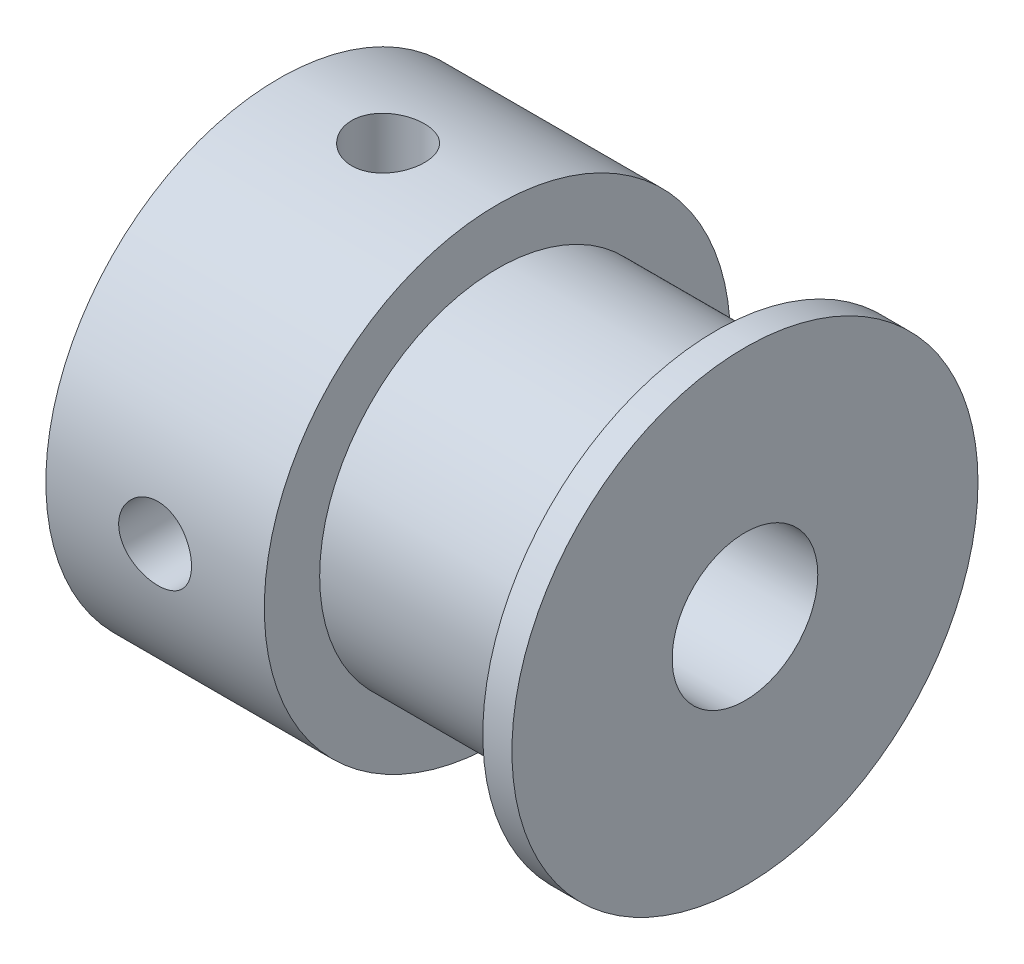
ISO-10303-21;
HEADER;
FILE_DESCRIPTION(('STEP AP214'),'2;1');
FILE_NAME('part.step','',(''),(''),'','','');
FILE_SCHEMA(('AUTOMOTIVE_DESIGN { 1 0 10303 214 1 1 1 1 }'));
ENDSEC;
DATA;
#1=APPLICATION_CONTEXT('core data for automotive mechanical design processes');
#2=APPLICATION_PROTOCOL_DEFINITION('international standard','automotive_design',2000,#1);
#3=PRODUCT_CONTEXT('',#1,'mechanical');
#4=PRODUCT('Part','Part','',(#3));
#5=PRODUCT_RELATED_PRODUCT_CATEGORY('part','',(#4));
#6=PRODUCT_DEFINITION_FORMATION('','',#4);
#7=PRODUCT_DEFINITION_CONTEXT('part definition',#1,'design');
#8=PRODUCT_DEFINITION('design','',#6,#7);
#9=PRODUCT_DEFINITION_SHAPE('','',#8);
#10=(LENGTH_UNIT() NAMED_UNIT(*) SI_UNIT(.MILLI.,.METRE.));
#11=(NAMED_UNIT(*) PLANE_ANGLE_UNIT() SI_UNIT($,.RADIAN.));
#12=(NAMED_UNIT(*) SI_UNIT($,.STERADIAN.) SOLID_ANGLE_UNIT());
#13=UNCERTAINTY_MEASURE_WITH_UNIT(LENGTH_MEASURE(1.E-05),#10,'distance_accuracy_value','');
#14=(GEOMETRIC_REPRESENTATION_CONTEXT(3) GLOBAL_UNCERTAINTY_ASSIGNED_CONTEXT((#13)) GLOBAL_UNIT_ASSIGNED_CONTEXT((#10,
#11,#12)) REPRESENTATION_CONTEXT('',''));
#15=CARTESIAN_POINT('',(0.,0.,0.));
#16=DIRECTION('',(0.,0.,1.));
#17=DIRECTION('',(1.,0.,0.));
#18=AXIS2_PLACEMENT_3D('',#15,#16,#17);
#19=CARTESIAN_POINT('',(0.,0.,0.));
#20=DIRECTION('',(1.,0.,0.));
#21=DIRECTION('',(0.,0.,-1.));
#22=AXIS2_PLACEMENT_3D('',#19,#20,#21);
#23=CYLINDRICAL_SURFACE('',#22,2.5);
#24=CARTESIAN_POINT('',(2.50000000000001,0.,2.5));
#25=CARTESIAN_POINT('',(2.50000412789938,0.0657149536912328,2.49999641755189));
#26=CARTESIAN_POINT('',(2.5052125914021,0.13150824962254,2.49738113774397));
#27=CARTESIAN_POINT('',(2.52581610042615,0.26115029408553,2.48717695046745));
#28=CARTESIAN_POINT('',(2.54123049124707,0.324995108391878,2.4795785978623));
#29=CARTESIAN_POINT('',(2.581492260771,0.448666931100716,2.4602034925414));
#30=CARTESIAN_POINT('',(2.60630298031002,0.508508503673972,2.448442989719));
#31=CARTESIAN_POINT('',(2.66446327670618,0.623090771008203,2.42182220644723));
#32=CARTESIAN_POINT('',(2.69781218031107,0.677831867487559,2.40696217041913));
#33=CARTESIAN_POINT('',(2.77439656185663,0.784384772202395,2.37445322822571));
#34=CARTESIAN_POINT('',(2.81810809904956,0.835819013902635,2.3566899890942));
#35=CARTESIAN_POINT('',(2.9131518490588,0.930974306083717,2.32074962808431));
#36=CARTESIAN_POINT('',(2.96448981471556,0.974689478883453,2.30257220261294));
#37=CARTESIAN_POINT('',(3.07810418690423,1.05656500056284,2.26623688996684));
#38=CARTESIAN_POINT('',(3.14092012293239,1.09403166943954,2.24818983712665));
#39=CARTESIAN_POINT('',(3.27295916998277,1.15771028361336,2.21607473465401));
#40=CARTESIAN_POINT('',(3.34217766090344,1.18393026870791,2.20200384508738));
#41=CARTESIAN_POINT('',(3.4808313817774,1.22266555273573,2.18072333797261));
#42=CARTESIAN_POINT('',(3.55000556508424,1.23590732135054,2.17315339479642));
#43=CARTESIAN_POINT('',(3.68997354722435,1.25053374163605,2.1647736243566));
#44=CARTESIAN_POINT('',(3.76076567608894,1.25193011046634,2.16395711679111));
#45=CARTESIAN_POINT('',(3.89285753039421,1.24335910896536,2.16888662821561));
#46=CARTESIAN_POINT('',(3.95428003902881,1.23473069942102,2.17385954577517));
#47=CARTESIAN_POINT('',(4.0746523867163,1.20867481132116,2.18845285917313));
#48=CARTESIAN_POINT('',(4.13360143163164,1.19124452987206,2.19807473539721));
#49=CARTESIAN_POINT('',(4.24903641570707,1.1477622254825,2.22109345515927));
#50=CARTESIAN_POINT('',(4.30543299848223,1.12151883389499,2.23457300829999));
#51=CARTESIAN_POINT('',(4.41329286573751,1.061302109585,2.26379255351755));
#52=CARTESIAN_POINT('',(4.46475391950011,1.02732530476558,2.27953355975239));
#53=CARTESIAN_POINT('',(4.56815156592903,0.94758256864098,2.31391447379108));
#54=CARTESIAN_POINT('',(4.61932109197019,0.900868072961596,2.33266887795933));
#55=CARTESIAN_POINT('',(4.71341927323862,0.799444473426711,2.36934529125509));
#56=CARTESIAN_POINT('',(4.75634399004235,0.744731570717852,2.38726689948501));
#57=CARTESIAN_POINT('',(4.83460707628715,0.625645632289806,2.42127484103705));
#58=CARTESIAN_POINT('',(4.86950059055717,0.560941989499257,2.43723730202509));
#59=CARTESIAN_POINT('',(4.92762128630376,0.425582769360993,2.46447351401553));
#60=CARTESIAN_POINT('',(4.95085773126895,0.354931970331593,2.47575098679441));
#61=CARTESIAN_POINT('',(4.98309425464584,0.215958114575875,2.49155417176795));
#62=CARTESIAN_POINT('',(4.99311404468347,0.147926913185404,2.4965617287664));
#63=CARTESIAN_POINT('',(5.00183091391811,0.010974499936691,2.50091266823877));
#64=CARTESIAN_POINT('',(5.00053335704934,-0.0579462748373773,2.5002587340164));
#65=CARTESIAN_POINT('',(4.98724163947655,-0.189041214982492,2.49363990316801));
#66=CARTESIAN_POINT('',(4.97608433408745,-0.251324260062442,2.48809057110237));
#67=CARTESIAN_POINT('',(4.94470241013114,-0.373008615377395,2.47277714143524));
#68=CARTESIAN_POINT('',(4.92447679193329,-0.432409607113745,2.46301257917916));
#69=CARTESIAN_POINT('',(4.87500191695853,-0.54861076056208,2.43980314267087));
#70=CARTESIAN_POINT('',(4.84551118735398,-0.60528799625769,2.42626102212424));
#71=CARTESIAN_POINT('',(4.77861558044244,-0.713076702123648,2.39679967896386));
#72=CARTESIAN_POINT('',(4.7412073317582,-0.7641857872191,2.38087944457232));
#73=CARTESIAN_POINT('',(4.6552994683339,-0.864709611613313,2.34635276671831));
#74=CARTESIAN_POINT('',(4.60607141443304,-0.913465097280795,2.32763606060552));
#75=CARTESIAN_POINT('',(4.50009356091336,-1.00232040139155,2.29077989504843));
#76=CARTESIAN_POINT('',(4.44333860147953,-1.04241423211355,2.27264084226908));
#77=CARTESIAN_POINT('',(4.32044543224961,-1.11463489312211,2.23813990282585));
#78=CARTESIAN_POINT('',(4.25398591723925,-1.14628186984829,2.2219066207934));
#79=CARTESIAN_POINT('',(4.11561241538434,-1.19760353251725,2.19467590460158));
#80=CARTESIAN_POINT('',(4.04370559187351,-1.21729364485946,2.18367172800773));
#81=CARTESIAN_POINT('',(3.90386222142319,-1.24232710931209,2.16951876260834));
#82=CARTESIAN_POINT('',(3.8362071832137,-1.24886624550107,2.16571729325615));
#83=CARTESIAN_POINT('',(3.70069116603659,-1.25086144297598,2.16456693307719));
#84=CARTESIAN_POINT('',(3.63283028907571,-1.24632230828049,2.16721524534441));
#85=CARTESIAN_POINT('',(3.50564562308498,-1.22740765699032,2.17797327562531));
#86=CARTESIAN_POINT('',(3.4461244123195,-1.21401039292849,2.18553868102992));
#87=CARTESIAN_POINT('',(3.33023985071912,-1.1789691977808,2.20463770234897));
#88=CARTESIAN_POINT('',(3.27387752238504,-1.15732261394976,2.21617259462095));
#89=CARTESIAN_POINT('',(3.16171893626674,-1.10476968162585,2.24285662955661));
#90=CARTESIAN_POINT('',(3.10621512271288,-1.07333892227057,2.25819652995239));
#91=CARTESIAN_POINT('',(3.00090682977427,-1.00268871454579,2.29044164543238));
#92=CARTESIAN_POINT('',(2.95110533685189,-0.963465214048303,2.30734767243153));
#93=CARTESIAN_POINT('',(2.85232252205298,-0.872754158330795,2.34327903949142));
#94=CARTESIAN_POINT('',(2.8041761220476,-0.820355528762707,2.36231229139336));
#95=CARTESIAN_POINT('',(2.71717127072046,-0.707693507775343,2.3984719031886));
#96=CARTESIAN_POINT('',(2.67831782571714,-0.647425904070975,2.4155972326005));
#97=CARTESIAN_POINT('',(2.61095454654725,-0.519914496024928,2.44622511981379));
#98=CARTESIAN_POINT('',(2.58251978823571,-0.452624379918262,2.45970120703636));
#99=CARTESIAN_POINT('',(2.53773979010132,-0.313427626617734,2.48126676704332));
#100=CARTESIAN_POINT('',(2.52136019146303,-0.241534749528953,2.48937154216165));
#101=CARTESIAN_POINT('',(2.50762823615519,-0.140752433104226,2.49619327387079));
#102=CARTESIAN_POINT('',(2.50477169892048,-0.112702349299371,2.49761706674002));
#103=CARTESIAN_POINT('',(2.500956668104,-0.0564396647589457,2.49952121222331));
#104=CARTESIAN_POINT('',(2.49999822691101,-0.0282270595592261,2.50000153879704));
#105=CARTESIAN_POINT('',(2.50000000000001,0.,2.5));
#106=B_SPLINE_CURVE_WITH_KNOTS('',3,(#24,#25,#26,#27,#28,#29,#30,#31,#32,#33,#34,#35,#36,#37,
#38,#39,#40,#41,#42,#43,#44,#45,#46,#47,#48,#49,#50,#51,#52,#53,#54,#55,#56,#57,#58,#59,#60,#61,
#62,#63,#64,#65,#66,#67,#68,#69,#70,#71,#72,#73,#74,#75,#76,#77,#78,#79,#80,#81,#82,#83,#84,#85,
#86,#87,#88,#89,#90,#91,#92,#93,#94,#95,#96,#97,#98,#99,#100,#101,#102,#103,#104,#105),
.UNSPECIFIED.,.T.,.F.,(4,2,2,2,2,2,2,2,2,2,2,2,2,2,2,2,2,2,2,2,2,2,2,2,2,2,2,2,2,2,2,2,2,2,2,2,
2,2,2,2,4),(0.,0.197030321775365,0.394435187136495,0.59107769436537,0.787704700726955,
0.996227198397606,1.20490779706754,1.4297715803844,1.6544743487285,1.86572515175286,
2.07676696661274,2.26257140511649,2.44843504907097,2.63862800210608,2.82890651575276,
3.04331176667346,3.25781918248356,3.48228777768049,3.70657771140347,3.9122911308918,
4.11790705639343,4.3075863313265,4.49728652038662,4.69241070034871,4.88761813435421,
5.10199513305521,5.31651985769287,5.54143352699589,5.76605639925969,5.96911634372964,
6.17208824825003,6.35572412805225,6.53941910979594,6.73545570969514,6.93159451423693,
7.15156553440619,7.37165479220712,7.59330017078652,7.81431135781158,7.89894100172117,
7.98357298143554),.UNSPECIFIED.);
#107=CARTESIAN_POINT('',(2.50000000000001,0.,2.5));
#108=VERTEX_POINT('',#107);
#109=EDGE_CURVE('E90',#108,#108,#106,.T.);
#110=ORIENTED_EDGE('',*,*,#109,.F.);
#111=EDGE_LOOP('',(#110));
#112=FACE_BOUND('',#111,.T.);
#113=CARTESIAN_POINT('',(3.75,2.1650635094611,-1.25));
#114=CARTESIAN_POINT('',(3.81513476024406,2.16506918410574,-1.24999545384316));
#115=CARTESIAN_POINT('',(3.88035176440631,2.16804751484696,-1.24487496341652));
#116=CARTESIAN_POINT('',(4.00878408084644,2.17952958065066,-1.22465401237257));
#117=CARTESIAN_POINT('',(4.07199489380426,2.18804492569449,-1.20953258069272));
#118=CARTESIAN_POINT('',(4.19431458042993,2.20936683256748,-1.17012493587476));
#119=CARTESIAN_POINT('',(4.25344331559198,2.22215054341565,-1.14588744061716));
#120=CARTESIAN_POINT('',(4.3667802524959,2.25053331021072,-1.08908440672046));
#121=CARTESIAN_POINT('',(4.42098818782807,2.26613251845081,-1.05651841754472));
#122=CARTESIAN_POINT('',(4.52788216069688,2.29996086321802,-0.980833175663598));
#123=CARTESIAN_POINT('',(4.58007391959193,2.31830079547442,-0.937065045179713));
#124=CARTESIAN_POINT('',(4.67676048550839,2.35464978482132,-0.841567259518085));
#125=CARTESIAN_POINT('',(4.7212514532294,2.37265867289062,-0.789833657227866));
#126=CARTESIAN_POINT('',(4.80420893893458,2.40776846191186,-0.675611954268182));
#127=CARTESIAN_POINT('',(4.84206720982441,2.42472633022716,-0.612633986265718));
#128=CARTESIAN_POINT('',(4.9064260665572,2.45438445124411,-0.48019628324938));
#129=CARTESIAN_POINT('',(4.93293382017146,2.46708738979677,-0.410740672672694));
#130=CARTESIAN_POINT('',(4.97188082662637,2.48600576555297,-0.272556179907472));
#131=CARTESIAN_POINT('',(4.98518690794442,2.49261850276115,-0.204127238111022));
#132=CARTESIAN_POINT('',(5.0002076483438,2.50009479807584,-0.0657132858723109));
#133=CARTESIAN_POINT('',(5.00192932099464,2.50096183480737,0.00427075730467233));
#134=CARTESIAN_POINT('',(4.99406665753706,2.49703727395563,0.137290655529687));
#135=CARTESIAN_POINT('',(4.98545248059847,2.49273119865201,0.200401498970988));
#136=CARTESIAN_POINT('',(4.95889894511918,2.47967806574684,0.324142214897901));
#137=CARTESIAN_POINT('',(4.94095888877972,2.47093067582992,0.384771901367406));
#138=CARTESIAN_POINT('',(4.89614679238773,2.44964479109568,0.502886739461941));
#139=CARTESIAN_POINT('',(4.86915460853491,2.43705551911499,0.560316779393971));
#140=CARTESIAN_POINT('',(4.80717072974813,2.40922057483359,0.669971001891659));
#141=CARTESIAN_POINT('',(4.77217617087206,2.39397395196855,0.722193311048306));
#142=CARTESIAN_POINT('',(4.69138081058373,2.36055492999037,0.825217076122742));
#143=CARTESIAN_POINT('',(4.64487121459249,2.34224219997719,0.875417593786699));
#144=CARTESIAN_POINT('',(4.54426284383728,2.30567925733515,0.967630462872224));
#145=CARTESIAN_POINT('',(4.49015828465742,2.28742910332036,1.00963651446779));
#146=CARTESIAN_POINT('',(4.37168975946989,2.25180195115606,1.08688166830276));
#147=CARTESIAN_POINT('',(4.30689247118224,2.23455399988385,1.12152164372256));
#148=CARTESIAN_POINT('',(4.17132791080125,2.2046931284822,1.17914889125154));
#149=CARTESIAN_POINT('',(4.10056695872805,2.19207537557584,1.20214832276361));
#150=CARTESIAN_POINT('',(3.96098186089651,2.17430794771293,1.2339752637813));
#151=CARTESIAN_POINT('',(3.89244860119556,2.16864569810621,1.24378140264997));
#152=CARTESIAN_POINT('',(3.75449832310432,2.16397399202012,1.25189618326428));
#153=CARTESIAN_POINT('',(3.68508196360027,2.1649598361164,1.25021294664378));
#154=CARTESIAN_POINT('',(3.55543260177659,2.17292920675731,1.23629505417996));
#155=CARTESIAN_POINT('',(3.49502568611509,2.17924484383318,1.22523477089058));
#156=CARTESIAN_POINT('',(3.3770402671613,2.19617526939176,1.19462035579055));
#157=CARTESIAN_POINT('',(3.31946268656674,2.20679145006292,1.17506347327952));
#158=CARTESIAN_POINT('',(3.20573583637163,2.23170277599571,1.12705948575611));
#159=CARTESIAN_POINT('',(3.14977622893306,2.24614554053829,1.0982425796159));
#160=CARTESIAN_POINT('',(3.04316341057626,2.27695149371562,1.03285883001976));
#161=CARTESIAN_POINT('',(2.9925129456084,2.29331566693935,0.99628800541527));
#162=CARTESIAN_POINT('',(2.89127654059557,2.3285999807042,0.911046458998567));
#163=CARTESIAN_POINT('',(2.84150356160293,2.34758228942861,0.861431590393708));
#164=CARTESIAN_POINT('',(2.75073470250801,2.38417793722366,0.754255619247861));
#165=CARTESIAN_POINT('',(2.70974178721183,2.40179081259637,0.696691843319184));
#166=CARTESIAN_POINT('',(2.63678284256237,2.43426702113696,0.573169203198447));
#167=CARTESIAN_POINT('',(2.60508360223636,2.44904552090037,0.507028871967642));
#168=CARTESIAN_POINT('',(2.55357762017826,2.47354193699126,0.369402955801353));
#169=CARTESIAN_POINT('',(2.53376043579212,2.48326429595466,0.29792212674022));
#170=CARTESIAN_POINT('',(2.50828929478167,2.49584385227353,0.158724602913022));
#171=CARTESIAN_POINT('',(2.50150265515486,2.49924909885239,0.0912643048130718));
#172=CARTESIAN_POINT('',(2.498945918182,2.50052662968914,-0.0439074824390039));
#173=CARTESIAN_POINT('',(2.50317196434555,2.49840085083612,-0.111618875368858));
#174=CARTESIAN_POINT('',(2.52177050849453,2.48917461047403,-0.240672490396433));
#175=CARTESIAN_POINT('',(2.53545606157209,2.48241118334988,-0.302140397264079));
#176=CARTESIAN_POINT('',(2.57165874912871,2.46490117079279,-0.421807440229521));
#177=CARTESIAN_POINT('',(2.59417715011682,2.45415401415995,-0.480006106194385));
#178=CARTESIAN_POINT('',(2.64840881520747,2.4290741343515,-0.594279257806105));
#179=CARTESIAN_POINT('',(2.6804741540098,2.41460771498499,-0.650156428375057));
#180=CARTESIAN_POINT('',(2.75244741357381,2.38360166427283,-0.75596830226753));
#181=CARTESIAN_POINT('',(2.79235893639459,2.36706108197951,-0.805900259268633));
#182=CARTESIAN_POINT('',(2.88349642377838,2.33160762783285,-0.903642505196113));
#183=CARTESIAN_POINT('',(2.93545310934649,2.31262248764623,-0.950747105674089));
#184=CARTESIAN_POINT('',(3.04681340141221,2.27578845203566,-1.03582910924334));
#185=CARTESIAN_POINT('',(3.10622352608461,2.25794057202332,-1.07379843751257));
#186=CARTESIAN_POINT('',(3.23329580822619,2.22499506631145,-1.14053884973207));
#187=CARTESIAN_POINT('',(3.30115941391092,2.21000217820338,-1.16898133245117));
#188=CARTESIAN_POINT('',(3.44166550542472,2.1858269541044,-1.21359838688301));
#189=CARTESIAN_POINT('',(3.51429111114086,2.17662520184628,-1.22981398896918));
#190=CARTESIAN_POINT('',(3.614756694565,2.16911590752238,-1.24295875983052));
#191=CARTESIAN_POINT('',(3.64170986799735,2.1676016125644,-1.24559513120481));
#192=CARTESIAN_POINT('',(3.6957706008528,2.16557419859688,-1.24911675636245));
#193=CARTESIAN_POINT('',(3.72287817048234,2.16506114656387,-1.25000189299984));
#194=CARTESIAN_POINT('',(3.75,2.1650635094611,-1.25));
#195=B_SPLINE_CURVE_WITH_KNOTS('',3,(#113,#114,#115,#116,#117,#118,#119,#120,#121,#122,#123,
#124,#125,#126,#127,#128,#129,#130,#131,#132,#133,#134,#135,#136,#137,#138,#139,#140,#141,#142,
#143,#144,#145,#146,#147,#148,#149,#150,#151,#152,#153,#154,#155,#156,#157,#158,#159,#160,#161,
#162,#163,#164,#165,#166,#167,#168,#169,#170,#171,#172,#173,#174,#175,#176,#177,#178,#179,#180,
#181,#182,#183,#184,#185,#186,#187,#188,#189,#190,#191,#192,#193,#194),.UNSPECIFIED.,.T.,.F.,(4,
2,2,2,2,2,2,2,2,2,2,2,2,2,2,2,2,2,2,2,2,2,2,2,2,2,2,2,2,2,2,2,2,2,2,2,2,2,2,2,4),(0.,
0.195290153243394,0.390991116031005,0.585660744898607,0.780340906806436,0.991077890622791,
1.20191963855464,1.42697365298454,1.65188533704864,1.86079356209919,2.0695752960755,
2.26020121855673,2.45084140646819,2.64411918413933,2.8374662418784,3.04908989321113,
3.26087560307398,3.4861105216181,3.71110967764631,3.91827863567764,4.12530116485466,
4.30967729280032,4.49411315545078,4.68709120507609,4.88016857775059,5.09758429475766,
5.31507331222752,5.53830226766207,5.76133474760964,5.96390337986858,6.16640108492464,
6.35555531089365,6.54473666890016,6.74200938399339,6.93937287625898,7.15637802312584,
7.37357428556442,7.59763436298256,7.8209391625345,7.90225168981636,7.98356965618175),.UNSPECIFIED.);
#196=CARTESIAN_POINT('',(3.75,2.1650635094611,-1.25));
#197=VERTEX_POINT('',#196);
#198=EDGE_CURVE('E81',#197,#197,#195,.T.);
#199=ORIENTED_EDGE('',*,*,#198,.F.);
#200=EDGE_LOOP('',(#199));
#201=FACE_BOUND('',#200,.T.);
#202=CARTESIAN_POINT('',(16.,0.,0.));
#203=DIRECTION('',(1.,0.,0.));
#204=DIRECTION('',(0.,0.,-1.));
#205=AXIS2_PLACEMENT_3D('',#202,#203,#204);
#206=CIRCLE('',#205,2.5);
#207=CARTESIAN_POINT('',(16.,0.,-2.5));
#208=VERTEX_POINT('',#207);
#209=EDGE_CURVE('E89',#208,#208,#206,.T.);
#210=ORIENTED_EDGE('',*,*,#209,.T.);
#211=EDGE_LOOP('',(#210));
#212=FACE_BOUND('',#211,.T.);
#213=CARTESIAN_POINT('',(0.,0.,0.));
#214=DIRECTION('',(1.,0.,0.));
#215=DIRECTION('',(0.,0.,-1.));
#216=AXIS2_PLACEMENT_3D('',#213,#214,#215);
#217=CIRCLE('',#216,2.5);
#218=CARTESIAN_POINT('',(0.,0.,-2.5));
#219=VERTEX_POINT('',#218);
#220=EDGE_CURVE('E55',#219,#219,#217,.T.);
#221=ORIENTED_EDGE('',*,*,#220,.F.);
#222=EDGE_LOOP('',(#221));
#223=FACE_BOUND('',#222,.T.);
#224=ADVANCED_FACE('F37',(#112,#201,#212,#223),#23,.F.);
#225=CARTESIAN_POINT('',(0.,2.5,0.));
#226=DIRECTION('',(-1.,0.,0.));
#227=DIRECTION('',(0.,0.,1.));
#228=AXIS2_PLACEMENT_3D('',#225,#226,#227);
#229=PLANE('',#228);
#230=ORIENTED_EDGE('',*,*,#220,.T.);
#231=EDGE_LOOP('',(#230));
#232=FACE_BOUND('',#231,.T.);
#233=CARTESIAN_POINT('',(0.,0.,0.));
#234=DIRECTION('',(1.,0.,0.));
#235=DIRECTION('',(0.,0.,-1.));
#236=AXIS2_PLACEMENT_3D('',#233,#234,#235);
#237=CIRCLE('',#236,8.);
#238=CARTESIAN_POINT('',(0.,0.,-8.));
#239=VERTEX_POINT('',#238);
#240=EDGE_CURVE('E60',#239,#239,#237,.T.);
#241=ORIENTED_EDGE('',*,*,#240,.F.);
#242=EDGE_LOOP('',(#241));
#243=FACE_BOUND('',#242,.T.);
#244=ADVANCED_FACE('F122',(#232,#243),#229,.T.);
#245=CARTESIAN_POINT('',(0.,0.,0.));
#246=DIRECTION('',(1.,0.,0.));
#247=DIRECTION('',(0.,0.,-1.));
#248=AXIS2_PLACEMENT_3D('',#245,#246,#247);
#249=CYLINDRICAL_SURFACE('',#248,8.);
#250=CARTESIAN_POINT('',(2.50000000000001,0.,8.));
#251=CARTESIAN_POINT('',(2.50000284913577,-0.069757548635516,7.99999885097242));
#252=CARTESIAN_POINT('',(2.50585905688679,-0.139554702432851,7.9990780624287));
#253=CARTESIAN_POINT('',(2.52912184563838,-0.277195657489049,7.99549349048796));
#254=CARTESIAN_POINT('',(2.54653944625176,-0.345037530661656,7.99282804422361));
#255=CARTESIAN_POINT('',(2.59238983140332,-0.476756269023699,7.98605348582888));
#256=CARTESIAN_POINT('',(2.62081404068081,-0.540636176144948,7.98194549781586));
#257=CARTESIAN_POINT('',(2.68784927257081,-0.662710625522296,7.97273897019077));
#258=CARTESIAN_POINT('',(2.72645897151798,-0.72090590518415,7.96764055931276));
#259=CARTESIAN_POINT('',(2.81311652417698,-0.830459955825804,7.95697134207178));
#260=CARTESIAN_POINT('',(2.86123349744513,-0.881763739571317,7.95139725696168));
#261=CARTESIAN_POINT('',(2.96539097413445,-0.975603844114111,7.94043038065143));
#262=CARTESIAN_POINT('',(3.0214319486501,-1.01813964327095,7.93503760025374));
#263=CARTESIAN_POINT('',(3.14021913567187,-1.09345272164441,7.92501214063723));
#264=CARTESIAN_POINT('',(3.2029997411809,-1.12617636778995,7.92038369893052));
#265=CARTESIAN_POINT('',(3.3332507054289,-1.18059340798532,7.91245600871183));
#266=CARTESIAN_POINT('',(3.40072078625528,-1.20228745505031,7.90915668151108));
#267=CARTESIAN_POINT('',(3.53785545057189,-1.23385779661083,7.90429317255518));
#268=CARTESIAN_POINT('',(3.6074977929094,-1.24382852743747,7.90271513266182));
#269=CARTESIAN_POINT('',(3.74748359444632,-1.2519618487881,7.90143085535887));
#270=CARTESIAN_POINT('',(3.81782700973302,-1.25012517430232,7.90172450144012));
#271=CARTESIAN_POINT('',(3.95654851592634,-1.23477290404444,7.90413775227603));
#272=CARTESIAN_POINT('',(4.02493861167657,-1.22136281479846,7.90624086092473));
#273=CARTESIAN_POINT('',(4.15848600317966,-1.18340968916875,7.91201028172737));
#274=CARTESIAN_POINT('',(4.22364320032027,-1.15886631342065,7.91567664153206));
#275=CARTESIAN_POINT('',(4.34919435633857,-1.09923458474692,7.92417753427311));
#276=CARTESIAN_POINT('',(4.40956689588653,-1.06410186157774,7.92901696543622));
#277=CARTESIAN_POINT('',(4.52359976784276,-0.98432029073318,7.93931523075049));
#278=CARTESIAN_POINT('',(4.57725962244373,-0.939670766265077,7.94477410894106));
#279=CARTESIAN_POINT('',(4.67695512331665,-0.841545444111659,7.95576893124448));
#280=CARTESIAN_POINT('',(4.72290157913472,-0.787979002802691,7.96130506817796));
#281=CARTESIAN_POINT('',(4.80516657281994,-0.673848473689676,7.97177562673913));
#282=CARTESIAN_POINT('',(4.84148506177841,-0.613284350340655,7.97671004531012));
#283=CARTESIAN_POINT('',(4.90346903671119,-0.486797963528243,7.98542699513518));
#284=CARTESIAN_POINT('',(4.92912727926649,-0.420872093120228,7.98920874270967));
#285=CARTESIAN_POINT('',(4.96898298372361,-0.285574767348378,7.99518780000339));
#286=CARTESIAN_POINT('',(4.98318128703323,-0.216203565343599,7.99738522604488));
#287=CARTESIAN_POINT('',(4.99959463822509,-0.0767541683818671,7.99993255863639));
#288=CARTESIAN_POINT('',(5.00193223948808,-0.00669073075435092,8.0003013589643));
#289=CARTESIAN_POINT('',(4.994883647332,0.13282727320582,7.99920143245634));
#290=CARTESIAN_POINT('',(4.98549784870544,0.202281859962577,7.99773276749821));
#291=CARTESIAN_POINT('',(4.9553708061599,0.33823672313285,7.99313461846611));
#292=CARTESIAN_POINT('',(4.93468962086613,0.404750631028019,7.99001392107693));
#293=CARTESIAN_POINT('',(4.8826224528006,0.53336703392831,7.98246037841779));
#294=CARTESIAN_POINT('',(4.85123593077866,0.5954693065197,7.97802746705036));
#295=CARTESIAN_POINT('',(4.77836400443671,0.714036101125199,7.96829486370472));
#296=CARTESIAN_POINT('',(4.73680128995476,0.770452561891857,7.9629886433171));
#297=CARTESIAN_POINT('',(4.6448639570461,0.875553482539025,7.95211940232218));
#298=CARTESIAN_POINT('',(4.59448878039757,0.924237452235083,7.94655636546338));
#299=CARTESIAN_POINT('',(4.48580940139139,1.01294040388345,7.93574013768325));
#300=CARTESIAN_POINT('',(4.42743757643883,1.05287699292062,7.93049020595401));
#301=CARTESIAN_POINT('',(4.30474196316933,1.12237783863319,7.92095346402914));
#302=CARTESIAN_POINT('',(4.24041834625526,1.15194239389052,7.91666662610999));
#303=CARTESIAN_POINT('',(4.1078851796429,1.19973385972497,7.90956535676178));
#304=CARTESIAN_POINT('',(4.03969126561719,1.21800327473955,7.9067454117448));
#305=CARTESIAN_POINT('',(3.90115542816801,1.24282061020267,7.90288285140397));
#306=CARTESIAN_POINT('',(3.8308136672905,1.24936941542498,7.9018401019222));
#307=CARTESIAN_POINT('',(3.69080064204626,1.25053726345377,7.90165529022442));
#308=CARTESIAN_POINT('',(3.62113045153325,1.24528590274212,7.90249258021451));
#309=CARTESIAN_POINT('',(3.48367735142786,1.2232811162795,7.90592849470915));
#310=CARTESIAN_POINT('',(3.41589443774914,1.2065277154348,7.90852711539976));
#311=CARTESIAN_POINT('',(3.28418108667974,1.16204164945925,7.91518544427453));
#312=CARTESIAN_POINT('',(3.2202472608708,1.1343188086929,7.91924384476704));
#313=CARTESIAN_POINT('',(3.09791719316187,1.06869384273208,7.92836592023698));
#314=CARTESIAN_POINT('',(3.03952117085579,1.03079131410442,7.93342963505413));
#315=CARTESIAN_POINT('',(2.92926722793659,0.945415040695392,7.9440578404613));
#316=CARTESIAN_POINT('',(2.87748390169309,0.897845535473836,7.94962700580145));
#317=CARTESIAN_POINT('',(2.78258938180664,0.794687973191015,7.96060021820367));
#318=CARTESIAN_POINT('',(2.73948020070407,0.739098060392157,7.96600422670061));
#319=CARTESIAN_POINT('',(2.66292438848422,0.621083429421703,7.9760755122835));
#320=CARTESIAN_POINT('',(2.6295373136202,0.558619686071188,7.98073817215134));
#321=CARTESIAN_POINT('',(2.57377950190353,0.42892594117889,7.9887562991944));
#322=CARTESIAN_POINT('',(2.55139751372081,0.361700888290879,7.9921131007106));
#323=CARTESIAN_POINT('',(2.52328348945471,0.245157119955796,7.9963872293244));
#324=CARTESIAN_POINT('',(2.51456575468551,0.196552787825812,7.99773495813061));
#325=CARTESIAN_POINT('',(2.50292304331047,0.0986388989252908,7.99954174348811));
#326=CARTESIAN_POINT('',(2.49999798522134,0.0493293520845592,8.00000081253982));
#327=CARTESIAN_POINT('',(2.50000000000001,0.,8.));
#328=B_SPLINE_CURVE_WITH_KNOTS('',3,(#250,#251,#252,#253,#254,#255,#256,#257,#258,#259,#260,
#261,#262,#263,#264,#265,#266,#267,#268,#269,#270,#271,#272,#273,#274,#275,#276,#277,#278,#279,
#280,#281,#282,#283,#284,#285,#286,#287,#288,#289,#290,#291,#292,#293,#294,#295,#296,#297,#298,
#299,#300,#301,#302,#303,#304,#305,#306,#307,#308,#309,#310,#311,#312,#313,#314,#315,#316,#317,
#318,#319,#320,#321,#322,#323,#324,#325,#326,#327),.UNSPECIFIED.,.T.,.F.,(4,2,2,2,2,2,2,2,2,2,2,
2,2,2,2,2,2,2,2,2,2,2,2,2,2,2,2,2,2,2,2,2,2,2,2,2,2,2,4),(0.,0.209092370238744,
0.418384321264004,0.62751353972051,0.836615593960145,1.04729784076099,1.2579926182271,
1.46981889302879,1.68163262504618,1.89172815567496,2.10181060835271,2.30999788011289,
2.51819149825524,2.72726988701172,2.93636314946032,3.14772866167181,3.35909524756912,
3.5706052187728,3.78209965914931,3.99140427002955,4.20070183264176,4.40889722378281,
4.61710310371013,4.82694270734833,5.03679560800705,5.24854740124792,5.46029309824487,
5.67123705197562,5.88216508114644,6.09078790799342,6.29941028309444,6.50784623483305,
6.7162904483567,6.92691006157766,7.13757848571145,7.34951152099917,7.56122742828135,
7.70909008175765,7.8569506552935),.UNSPECIFIED.);
#329=CARTESIAN_POINT('',(2.50000000000001,0.,8.));
#330=VERTEX_POINT('',#329);
#331=EDGE_CURVE('E10',#330,#330,#328,.T.);
#332=ORIENTED_EDGE('',*,*,#331,.F.);
#333=EDGE_LOOP('',(#332));
#334=FACE_BOUND('',#333,.T.);
#335=CARTESIAN_POINT('',(5.,8.,0.));
#336=CARTESIAN_POINT('',(4.99999715086424,7.99999885097242,-0.0697575486355163));
#337=CARTESIAN_POINT('',(4.99414094311322,7.9990780624287,-0.139554702432852));
#338=CARTESIAN_POINT('',(4.97087815436162,7.99549349048796,-0.27719565748905));
#339=CARTESIAN_POINT('',(4.95346055374824,7.99282804422361,-0.345037530661658));
#340=CARTESIAN_POINT('',(4.90761016859669,7.98605348582888,-0.476756269023701));
#341=CARTESIAN_POINT('',(4.8791859593192,7.98194549781586,-0.540636176144951));
#342=CARTESIAN_POINT('',(4.81215072742919,7.97273897019077,-0.662710625522299));
#343=CARTESIAN_POINT('',(4.77354102848203,7.96764055931276,-0.720905905184153));
#344=CARTESIAN_POINT('',(4.68688347582302,7.95697134207178,-0.830459955825808));
#345=CARTESIAN_POINT('',(4.63876650255487,7.95139725696168,-0.881763739571322));
#346=CARTESIAN_POINT('',(4.53460902586555,7.94043038065143,-0.975603844114116));
#347=CARTESIAN_POINT('',(4.4785680513499,7.93503760025374,-1.01813964327096));
#348=CARTESIAN_POINT('',(4.35978086432814,7.92501214063723,-1.09345272164442));
#349=CARTESIAN_POINT('',(4.2970002588191,7.92038369893052,-1.12617636778996));
#350=CARTESIAN_POINT('',(4.1667492945711,7.91245600871182,-1.18059340798532));
#351=CARTESIAN_POINT('',(4.09927921374472,7.90915668151108,-1.20228745505032));
#352=CARTESIAN_POINT('',(3.96214454942811,7.90429317255518,-1.23385779661083));
#353=CARTESIAN_POINT('',(3.8925022070906,7.90271513266182,-1.24382852743748));
#354=CARTESIAN_POINT('',(3.75251640555368,7.90143085535887,-1.25196184878811));
#355=CARTESIAN_POINT('',(3.68217299026698,7.90172450144011,-1.25012517430233));
#356=CARTESIAN_POINT('',(3.54345148407366,7.90413775227603,-1.23477290404445));
#357=CARTESIAN_POINT('',(3.47506138832343,7.90624086092473,-1.22136281479846));
#358=CARTESIAN_POINT('',(3.34151399682034,7.91201028172736,-1.18340968916876));
#359=CARTESIAN_POINT('',(3.27635679967973,7.91567664153206,-1.15886631342066));
#360=CARTESIAN_POINT('',(3.15080564366142,7.92417753427311,-1.09923458474692));
#361=CARTESIAN_POINT('',(3.09043310411347,7.92901696543622,-1.06410186157774));
#362=CARTESIAN_POINT('',(2.97640023215723,7.93931523075049,-0.984320290733185));
#363=CARTESIAN_POINT('',(2.92274037755627,7.94477410894106,-0.939670766265082));
#364=CARTESIAN_POINT('',(2.82304487668334,7.95576893124448,-0.841545444111663));
#365=CARTESIAN_POINT('',(2.77709842086527,7.96130506817796,-0.787979002802695));
#366=CARTESIAN_POINT('',(2.69483342718005,7.97177562673913,-0.67384847368968));
#367=CARTESIAN_POINT('',(2.65851493822159,7.97671004531012,-0.613284350340659));
#368=CARTESIAN_POINT('',(2.5965309632888,7.98542699513518,-0.486797963528246));
#369=CARTESIAN_POINT('',(2.5708727207335,7.98920874270967,-0.42087209312023));
#370=CARTESIAN_POINT('',(2.53101701627639,7.99518780000339,-0.28557476734838));
#371=CARTESIAN_POINT('',(2.51681871296676,7.99738522604488,-0.2162035653436));
#372=CARTESIAN_POINT('',(2.50040536177491,7.99993255863639,-0.0767541683818673));
#373=CARTESIAN_POINT('',(2.49806776051191,8.0003013589643,-0.00669073075435062));
#374=CARTESIAN_POINT('',(2.50511635266799,7.99920143245634,0.132827273205821));
#375=CARTESIAN_POINT('',(2.51450215129455,7.99773276749821,0.202281859962578));
#376=CARTESIAN_POINT('',(2.54462919384009,7.99313461846611,0.338236723132852));
#377=CARTESIAN_POINT('',(2.56531037913387,7.99001392107693,0.40475063102802));
#378=CARTESIAN_POINT('',(2.6173775471994,7.98246037841779,0.533367033928313));
#379=CARTESIAN_POINT('',(2.64876406922134,7.97802746705036,0.595469306519703));
#380=CARTESIAN_POINT('',(2.72163599556329,7.96829486370472,0.714036101125203));
#381=CARTESIAN_POINT('',(2.76319871004524,7.9629886433171,0.770452561891861));
#382=CARTESIAN_POINT('',(2.85513604295389,7.95211940232218,0.875553482539029));
#383=CARTESIAN_POINT('',(2.90551121960243,7.94655636546338,0.924237452235088));
#384=CARTESIAN_POINT('',(3.01419059860861,7.93574013768325,1.01294040388345));
#385=CARTESIAN_POINT('',(3.07256242356117,7.93049020595401,1.05287699292063));
#386=CARTESIAN_POINT('',(3.19525803683067,7.92095346402914,1.1223778386332));
#387=CARTESIAN_POINT('',(3.25958165374474,7.91666662610998,1.15194239389052));
#388=CARTESIAN_POINT('',(3.3921148203571,7.90956535676178,1.19973385972497));
#389=CARTESIAN_POINT('',(3.46030873438281,7.9067454117448,1.21800327473956));
#390=CARTESIAN_POINT('',(3.59884457183199,7.90288285140397,1.24282061020268));
#391=CARTESIAN_POINT('',(3.6691863327095,7.9018401019222,1.24936941542499));
#392=CARTESIAN_POINT('',(3.80919935795374,7.90165529022442,1.25053726345378));
#393=CARTESIAN_POINT('',(3.87886954846675,7.90249258021451,1.24528590274212));
#394=CARTESIAN_POINT('',(4.01632264857214,7.90592849470915,1.2232811162795));
#395=CARTESIAN_POINT('',(4.08410556225086,7.90852711539975,1.20652771543481));
#396=CARTESIAN_POINT('',(4.21581891332026,7.91518544427453,1.16204164945926));
#397=CARTESIAN_POINT('',(4.27975273912921,7.91924384476704,1.1343188086929));
#398=CARTESIAN_POINT('',(4.40208280683814,7.92836592023698,1.06869384273208));
#399=CARTESIAN_POINT('',(4.46047882914421,7.93342963505413,1.03079131410443));
#400=CARTESIAN_POINT('',(4.57073277206342,7.9440578404613,0.945415040695397));
#401=CARTESIAN_POINT('',(4.62251609830692,7.94962700580145,0.89784553547384));
#402=CARTESIAN_POINT('',(4.71741061819337,7.96060021820367,0.794687973191019));
#403=CARTESIAN_POINT('',(4.76051979929594,7.96600422670061,0.739098060392161));
#404=CARTESIAN_POINT('',(4.83707561151578,7.9760755122835,0.621083429421706));
#405=CARTESIAN_POINT('',(4.87046268637981,7.98073817215134,0.55861968607119));
#406=CARTESIAN_POINT('',(4.92622049809647,7.9887562991944,0.428925941178892));
#407=CARTESIAN_POINT('',(4.94860248627919,7.9921131007106,0.361700888290881));
#408=CARTESIAN_POINT('',(4.97671651054529,7.9963872293244,0.245157119955797));
#409=CARTESIAN_POINT('',(4.9854342453145,7.99773495813061,0.196552787825812));
#410=CARTESIAN_POINT('',(4.99707695668954,7.99954174348811,0.0986388989252909));
#411=CARTESIAN_POINT('',(5.00000201477867,8.00000081253982,0.0493293520845592));
#412=CARTESIAN_POINT('',(5.,8.,0.));
#413=B_SPLINE_CURVE_WITH_KNOTS('',3,(#335,#336,#337,#338,#339,#340,#341,#342,#343,#344,#345,
#346,#347,#348,#349,#350,#351,#352,#353,#354,#355,#356,#357,#358,#359,#360,#361,#362,#363,#364,
#365,#366,#367,#368,#369,#370,#371,#372,#373,#374,#375,#376,#377,#378,#379,#380,#381,#382,#383,
#384,#385,#386,#387,#388,#389,#390,#391,#392,#393,#394,#395,#396,#397,#398,#399,#400,#401,#402,
#403,#404,#405,#406,#407,#408,#409,#410,#411,#412),.UNSPECIFIED.,.T.,.F.,(4,2,2,2,2,2,2,2,2,2,2,
2,2,2,2,2,2,2,2,2,2,2,2,2,2,2,2,2,2,2,2,2,2,2,2,2,2,2,4),(0.,0.209092370238745,
0.418384321264006,0.627513539720513,0.836615593960149,1.047297840761,1.25799261822711,
1.46981889302879,1.68163262504619,1.89172815567497,2.10181060835272,2.3099978801129,
2.51819149825525,2.72726988701173,2.93636314946034,3.14772866167183,3.35909524756913,
3.57060521877282,3.78209965914933,3.99140427002957,4.20070183264178,4.40889722378283,
4.61710310371015,4.82694270734835,5.03679560800707,5.24854740124795,5.4602930982449,
5.67123705197565,5.88216508114647,6.09078790799345,6.29941028309447,6.50784623483309,
6.71629044835673,6.9269100615777,7.13757848571149,7.3495115209992,7.56122742828139,
7.70909008175769,7.85695065529354),.UNSPECIFIED.);
#414=CARTESIAN_POINT('',(5.,8.,0.));
#415=VERTEX_POINT('',#414);
#416=EDGE_CURVE('E50',#415,#415,#413,.T.);
#417=ORIENTED_EDGE('',*,*,#416,.F.);
#418=EDGE_LOOP('',(#417));
#419=FACE_BOUND('',#418,.T.);
#420=ORIENTED_EDGE('',*,*,#240,.T.);
#421=EDGE_LOOP('',(#420));
#422=FACE_BOUND('',#421,.T.);
#423=CARTESIAN_POINT('',(7.5,0.,0.));
#424=DIRECTION('',(1.,0.,0.));
#425=DIRECTION('',(0.,0.,-1.));
#426=AXIS2_PLACEMENT_3D('',#423,#424,#425);
#427=CIRCLE('',#426,8.);
#428=CARTESIAN_POINT('',(7.5,0.,-8.));
#429=VERTEX_POINT('',#428);
#430=EDGE_CURVE('E113',#429,#429,#427,.T.);
#431=ORIENTED_EDGE('',*,*,#430,.F.);
#432=EDGE_LOOP('',(#431));
#433=FACE_BOUND('',#432,.T.);
#434=ADVANCED_FACE('F67',(#334,#419,#422,#433),#249,.T.);
#435=CARTESIAN_POINT('',(7.5,8.,0.));
#436=DIRECTION('',(1.,0.,0.));
#437=DIRECTION('',(0.,0.,-1.));
#438=AXIS2_PLACEMENT_3D('',#435,#436,#437);
#439=PLANE('',#438);
#440=ORIENTED_EDGE('',*,*,#430,.T.);
#441=EDGE_LOOP('',(#440));
#442=FACE_BOUND('',#441,.T.);
#443=CARTESIAN_POINT('',(7.5,0.,0.));
#444=DIRECTION('',(1.,0.,0.));
#445=DIRECTION('',(0.,0.,-1.));
#446=AXIS2_PLACEMENT_3D('',#443,#444,#445);
#447=CIRCLE('',#446,6.1);
#448=CARTESIAN_POINT('',(7.5,0.,-6.1));
#449=VERTEX_POINT('',#448);
#450=EDGE_CURVE('E109',#449,#449,#447,.T.);
#451=ORIENTED_EDGE('',*,*,#450,.F.);
#452=EDGE_LOOP('',(#451));
#453=FACE_BOUND('',#452,.T.);
#454=ADVANCED_FACE('F129',(#442,#453),#439,.T.);
#455=CARTESIAN_POINT('',(0.,0.,0.));
#456=DIRECTION('',(1.,0.,0.));
#457=DIRECTION('',(0.,0.,-1.));
#458=AXIS2_PLACEMENT_3D('',#455,#456,#457);
#459=CYLINDRICAL_SURFACE('',#458,6.1);
#460=ORIENTED_EDGE('',*,*,#450,.T.);
#461=EDGE_LOOP('',(#460));
#462=FACE_BOUND('',#461,.T.);
#463=CARTESIAN_POINT('',(15.,0.,0.));
#464=DIRECTION('',(1.,0.,0.));
#465=DIRECTION('',(0.,0.,-1.));
#466=AXIS2_PLACEMENT_3D('',#463,#464,#465);
#467=CIRCLE('',#466,6.1);
#468=CARTESIAN_POINT('',(15.,0.,-6.1));
#469=VERTEX_POINT('',#468);
#470=EDGE_CURVE('E105',#469,#469,#467,.T.);
#471=ORIENTED_EDGE('',*,*,#470,.F.);
#472=EDGE_LOOP('',(#471));
#473=FACE_BOUND('',#472,.T.);
#474=ADVANCED_FACE('F156',(#462,#473),#459,.T.);
#475=CARTESIAN_POINT('',(15.,6.1,0.));
#476=DIRECTION('',(-1.,0.,0.));
#477=DIRECTION('',(0.,0.,1.));
#478=AXIS2_PLACEMENT_3D('',#475,#476,#477);
#479=PLANE('',#478);
#480=ORIENTED_EDGE('',*,*,#470,.T.);
#481=EDGE_LOOP('',(#480));
#482=FACE_BOUND('',#481,.T.);
#483=CARTESIAN_POINT('',(15.,0.,0.));
#484=DIRECTION('',(1.,0.,0.));
#485=DIRECTION('',(0.,0.,-1.));
#486=AXIS2_PLACEMENT_3D('',#483,#484,#485);
#487=CIRCLE('',#486,8.);
#488=CARTESIAN_POINT('',(15.,0.,-8.));
#489=VERTEX_POINT('',#488);
#490=EDGE_CURVE('E101',#489,#489,#487,.T.);
#491=ORIENTED_EDGE('',*,*,#490,.F.);
#492=EDGE_LOOP('',(#491));
#493=FACE_BOUND('',#492,.T.);
#494=ADVANCED_FACE('F149',(#482,#493),#479,.T.);
#495=CARTESIAN_POINT('',(0.,0.,0.));
#496=DIRECTION('',(1.,0.,0.));
#497=DIRECTION('',(0.,0.,-1.));
#498=AXIS2_PLACEMENT_3D('',#495,#496,#497);
#499=CYLINDRICAL_SURFACE('',#498,8.);
#500=ORIENTED_EDGE('',*,*,#490,.T.);
#501=EDGE_LOOP('',(#500));
#502=FACE_BOUND('',#501,.T.);
#503=CARTESIAN_POINT('',(16.,0.,0.));
#504=DIRECTION('',(1.,0.,0.));
#505=DIRECTION('',(0.,0.,-1.));
#506=AXIS2_PLACEMENT_3D('',#503,#504,#505);
#507=CIRCLE('',#506,8.);
#508=CARTESIAN_POINT('',(16.,0.,-8.));
#509=VERTEX_POINT('',#508);
#510=EDGE_CURVE('E97',#509,#509,#507,.T.);
#511=ORIENTED_EDGE('',*,*,#510,.F.);
#512=EDGE_LOOP('',(#511));
#513=FACE_BOUND('',#512,.T.);
#514=ADVANCED_FACE('F144',(#502,#513),#499,.T.);
#515=CARTESIAN_POINT('',(16.,8.,0.));
#516=DIRECTION('',(1.,0.,0.));
#517=DIRECTION('',(0.,0.,-1.));
#518=AXIS2_PLACEMENT_3D('',#515,#516,#517);
#519=PLANE('',#518);
#520=ORIENTED_EDGE('',*,*,#510,.T.);
#521=EDGE_LOOP('',(#520));
#522=FACE_BOUND('',#521,.T.);
#523=ORIENTED_EDGE('',*,*,#209,.F.);
#524=EDGE_LOOP('',(#523));
#525=FACE_BOUND('',#524,.T.);
#526=ADVANCED_FACE('F75',(#522,#525),#519,.T.);
#527=CARTESIAN_POINT('',(3.75,0.,0.));
#528=DIRECTION('',(0.,-1.,0.));
#529=DIRECTION('',(0.,0.,-1.));
#530=AXIS2_PLACEMENT_3D('',#527,#528,#529);
#531=CYLINDRICAL_SURFACE('',#530,1.25);
#532=ORIENTED_EDGE('',*,*,#198,.T.);
#533=EDGE_LOOP('',(#532));
#534=FACE_BOUND('',#533,.T.);
#535=ORIENTED_EDGE('',*,*,#416,.T.);
#536=EDGE_LOOP('',(#535));
#537=FACE_BOUND('',#536,.T.);
#538=ADVANCED_FACE('F70',(#534,#537),#531,.F.);
#539=CARTESIAN_POINT('',(3.75,0.,0.));
#540=DIRECTION('',(0.,0.,-1.));
#541=DIRECTION('',(-1.,0.,0.));
#542=AXIS2_PLACEMENT_3D('',#539,#540,#541);
#543=CYLINDRICAL_SURFACE('',#542,1.24999999999999);
#544=ORIENTED_EDGE('',*,*,#109,.T.);
#545=EDGE_LOOP('',(#544));
#546=FACE_BOUND('',#545,.T.);
#547=ORIENTED_EDGE('',*,*,#331,.T.);
#548=EDGE_LOOP('',(#547));
#549=FACE_BOUND('',#548,.T.);
#550=ADVANCED_FACE('F74',(#546,#549),#543,.F.);
#551=CLOSED_SHELL('',(#224,#244,#434,#454,#474,#494,#514,#526,#538,#550));
#552=MANIFOLD_SOLID_BREP('B2',#551);
#553=ADVANCED_BREP_SHAPE_REPRESENTATION('',(#18,#552),#14);
#554=SHAPE_DEFINITION_REPRESENTATION(#9,#553);
ENDSEC;
END-ISO-10303-21;
